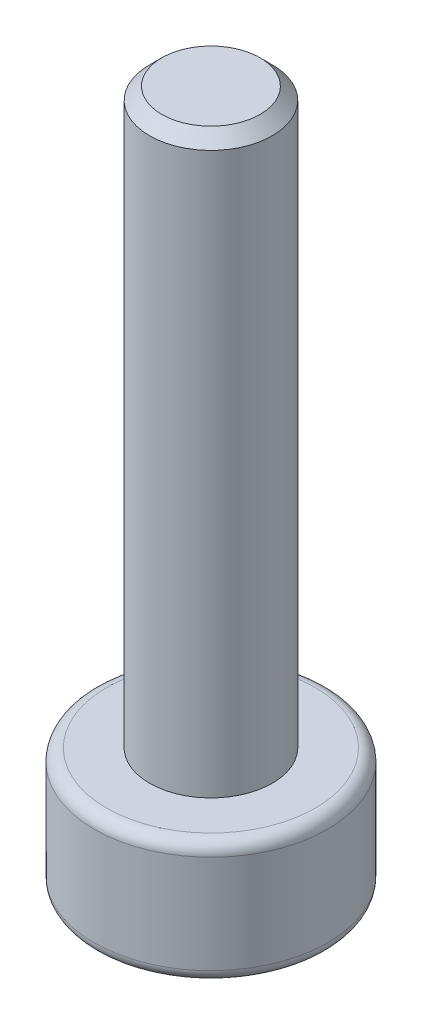
ISO-10303-21;
HEADER;
FILE_DESCRIPTION(('STEP AP214'),'2;1');
FILE_NAME('part.step','',(''),(''),'','','');
FILE_SCHEMA(('AUTOMOTIVE_DESIGN { 1 0 10303 214 1 1 1 1 }'));
ENDSEC;
DATA;
#1=APPLICATION_CONTEXT('core data for automotive mechanical design processes');
#2=APPLICATION_PROTOCOL_DEFINITION('international standard','automotive_design',2000,#1);
#3=PRODUCT_CONTEXT('',#1,'mechanical');
#4=PRODUCT('Part','Part','',(#3));
#5=PRODUCT_RELATED_PRODUCT_CATEGORY('part','',(#4));
#6=PRODUCT_DEFINITION_FORMATION('','',#4);
#7=PRODUCT_DEFINITION_CONTEXT('part definition',#1,'design');
#8=PRODUCT_DEFINITION('design','',#6,#7);
#9=PRODUCT_DEFINITION_SHAPE('','',#8);
#10=(LENGTH_UNIT() NAMED_UNIT(*) SI_UNIT(.MILLI.,.METRE.));
#11=(NAMED_UNIT(*) PLANE_ANGLE_UNIT() SI_UNIT($,.RADIAN.));
#12=(NAMED_UNIT(*) SI_UNIT($,.STERADIAN.) SOLID_ANGLE_UNIT());
#13=UNCERTAINTY_MEASURE_WITH_UNIT(LENGTH_MEASURE(1.E-05),#10,'distance_accuracy_value','');
#14=(GEOMETRIC_REPRESENTATION_CONTEXT(3) GLOBAL_UNCERTAINTY_ASSIGNED_CONTEXT((#13)) GLOBAL_UNIT_ASSIGNED_CONTEXT((#10,
#11,#12)) REPRESENTATION_CONTEXT('',''));
#15=CARTESIAN_POINT('',(0.,0.,0.));
#16=DIRECTION('',(0.,0.,1.));
#17=DIRECTION('',(1.,0.,0.));
#18=AXIS2_PLACEMENT_3D('',#15,#16,#17);
#19=CARTESIAN_POINT('',(0.,3.,0.));
#20=DIRECTION('',(0.,-1.,0.));
#21=DIRECTION('',(0.,0.,-1.));
#22=AXIS2_PLACEMENT_3D('',#19,#20,#21);
#23=CYLINDRICAL_SURFACE('',#22,2.85);
#24=CARTESIAN_POINT('',(0.,2.7,0.));
#25=DIRECTION('',(0.,1.,0.));
#26=DIRECTION('',(0.,0.,1.));
#27=AXIS2_PLACEMENT_3D('',#24,#25,#26);
#28=CIRCLE('',#27,2.85);
#29=CARTESIAN_POINT('',(0.,2.7,2.85));
#30=VERTEX_POINT('',#29);
#31=EDGE_CURVE('E68',#30,#30,#28,.F.);
#32=ORIENTED_EDGE('',*,*,#31,.T.);
#33=EDGE_LOOP('',(#32));
#34=FACE_BOUND('',#33,.T.);
#35=CARTESIAN_POINT('',(0.,0.3,0.));
#36=DIRECTION('',(0.,1.,0.));
#37=DIRECTION('',(0.,0.,1.));
#38=AXIS2_PLACEMENT_3D('',#35,#36,#37);
#39=CIRCLE('',#38,2.85);
#40=CARTESIAN_POINT('',(0.,0.3,2.85));
#41=VERTEX_POINT('',#40);
#42=EDGE_CURVE('E72',#41,#41,#39,.T.);
#43=ORIENTED_EDGE('',*,*,#42,.T.);
#44=EDGE_LOOP('',(#43));
#45=FACE_BOUND('',#44,.T.);
#46=ADVANCED_FACE('F39',(#34,#45),#23,.T.);
#47=CARTESIAN_POINT('',(0.,3.,0.));
#48=DIRECTION('',(0.,1.,0.));
#49=DIRECTION('',(0.,0.,1.));
#50=AXIS2_PLACEMENT_3D('',#47,#48,#49);
#51=PLANE('',#50);
#52=CARTESIAN_POINT('',(0.,3.,0.));
#53=DIRECTION('',(0.,1.,0.));
#54=DIRECTION('',(0.,0.,1.));
#55=AXIS2_PLACEMENT_3D('',#52,#53,#54);
#56=CIRCLE('',#55,2.55);
#57=CARTESIAN_POINT('',(0.,3.,2.55));
#58=VERTEX_POINT('',#57);
#59=EDGE_CURVE('E76',#58,#58,#56,.T.);
#60=ORIENTED_EDGE('',*,*,#59,.T.);
#61=EDGE_LOOP('',(#60));
#62=FACE_BOUND('',#61,.T.);
#63=CARTESIAN_POINT('',(0.,3.,0.));
#64=DIRECTION('',(0.,1.,0.));
#65=DIRECTION('',(0.,0.,1.));
#66=AXIS2_PLACEMENT_3D('',#63,#64,#65);
#67=CIRCLE('',#66,1.5);
#68=CARTESIAN_POINT('',(0.,3.,1.5));
#69=VERTEX_POINT('',#68);
#70=EDGE_CURVE('E80',#69,#69,#67,.T.);
#71=ORIENTED_EDGE('',*,*,#70,.F.);
#72=EDGE_LOOP('',(#71));
#73=FACE_BOUND('',#72,.T.);
#74=ADVANCED_FACE('F105',(#62,#73),#51,.T.);
#75=CARTESIAN_POINT('',(0.,0.,0.));
#76=DIRECTION('',(0.,1.,0.));
#77=DIRECTION('',(0.,0.,1.));
#78=AXIS2_PLACEMENT_3D('',#75,#76,#77);
#79=PLANE('',#78);
#80=CARTESIAN_POINT('',(0.,0.,0.));
#81=DIRECTION('',(0.,1.,0.));
#82=DIRECTION('',(0.,0.,1.));
#83=AXIS2_PLACEMENT_3D('',#80,#81,#82);
#84=CIRCLE('',#83,1.44);
#85=CARTESIAN_POINT('',(0.,0.,1.44));
#86=VERTEX_POINT('',#85);
#87=EDGE_CURVE('E10',#86,#86,#84,.T.);
#88=ORIENTED_EDGE('',*,*,#87,.T.);
#89=EDGE_LOOP('',(#88));
#90=FACE_BOUND('',#89,.T.);
#91=CARTESIAN_POINT('',(0.,0.,0.));
#92=DIRECTION('',(0.,1.,0.));
#93=DIRECTION('',(0.,0.,1.));
#94=AXIS2_PLACEMENT_3D('',#91,#92,#93);
#95=CIRCLE('',#94,2.55);
#96=CARTESIAN_POINT('',(0.,0.,2.55));
#97=VERTEX_POINT('',#96);
#98=EDGE_CURVE('E64',#97,#97,#95,.F.);
#99=ORIENTED_EDGE('',*,*,#98,.T.);
#100=EDGE_LOOP('',(#99));
#101=FACE_BOUND('',#100,.T.);
#102=ADVANCED_FACE('F111',(#90,#101),#79,.F.);
#103=CARTESIAN_POINT('',(0.,17.,0.));
#104=DIRECTION('',(0.,-1.,0.));
#105=DIRECTION('',(0.,0.,-1.));
#106=AXIS2_PLACEMENT_3D('',#103,#104,#105);
#107=CYLINDRICAL_SURFACE('',#106,1.5);
#108=CARTESIAN_POINT('',(0.,16.7,0.));
#109=DIRECTION('',(0.,1.,0.));
#110=DIRECTION('',(0.,0.,1.));
#111=AXIS2_PLACEMENT_3D('',#108,#109,#110);
#112=CIRCLE('',#111,1.5);
#113=CARTESIAN_POINT('',(0.,16.7,1.5));
#114=VERTEX_POINT('',#113);
#115=EDGE_CURVE('E53',#114,#114,#112,.F.);
#116=ORIENTED_EDGE('',*,*,#115,.T.);
#117=EDGE_LOOP('',(#116));
#118=FACE_BOUND('',#117,.T.);
#119=ORIENTED_EDGE('',*,*,#70,.T.);
#120=EDGE_LOOP('',(#119));
#121=FACE_BOUND('',#120,.T.);
#122=ADVANCED_FACE('F101',(#118,#121),#107,.T.);
#123=CARTESIAN_POINT('',(0.,17.,0.));
#124=DIRECTION('',(0.,1.,0.));
#125=DIRECTION('',(0.,0.,1.));
#126=AXIS2_PLACEMENT_3D('',#123,#124,#125);
#127=PLANE('',#126);
#128=CARTESIAN_POINT('',(0.,17.,0.));
#129=DIRECTION('',(0.,1.,0.));
#130=DIRECTION('',(0.,0.,1.));
#131=AXIS2_PLACEMENT_3D('',#128,#129,#130);
#132=CIRCLE('',#131,1.2);
#133=CARTESIAN_POINT('',(0.,17.,1.2));
#134=VERTEX_POINT('',#133);
#135=EDGE_CURVE('E58',#134,#134,#132,.T.);
#136=ORIENTED_EDGE('',*,*,#135,.T.);
#137=EDGE_LOOP('',(#136));
#138=FACE_BOUND('',#137,.T.);
#139=ADVANCED_FACE('F93',(#138),#127,.T.);
#140=CARTESIAN_POINT('',(0.,1.3,0.));
#141=DIRECTION('',(0.,-1.,0.));
#142=DIRECTION('',(0.,0.,-1.));
#143=AXIS2_PLACEMENT_3D('',#140,#141,#142);
#144=CYLINDRICAL_SURFACE('',#143,1.29);
#145=CARTESIAN_POINT('',(0.,0.149999999999998,0.));
#146=DIRECTION('',(0.,1.,0.));
#147=DIRECTION('',(0.,0.,1.));
#148=AXIS2_PLACEMENT_3D('',#145,#146,#147);
#149=CIRCLE('',#148,1.29);
#150=CARTESIAN_POINT('',(0.,0.149999999999998,1.29));
#151=VERTEX_POINT('',#150);
#152=EDGE_CURVE('E48',#151,#151,#149,.F.);
#153=ORIENTED_EDGE('',*,*,#152,.T.);
#154=EDGE_LOOP('',(#153));
#155=FACE_BOUND('',#154,.T.);
#156=CARTESIAN_POINT('',(0.,1.3,0.));
#157=DIRECTION('',(0.,-1.,0.));
#158=DIRECTION('',(0.,0.,-1.));
#159=AXIS2_PLACEMENT_3D('',#156,#157,#158);
#160=CIRCLE('',#159,1.29);
#161=CARTESIAN_POINT('',(0.,1.3,-1.29));
#162=VERTEX_POINT('',#161);
#163=EDGE_CURVE('E84',#162,#162,#160,.T.);
#164=ORIENTED_EDGE('',*,*,#163,.F.);
#165=EDGE_LOOP('',(#164));
#166=FACE_BOUND('',#165,.T.);
#167=ADVANCED_FACE('F91',(#155,#166),#144,.F.);
#168=CARTESIAN_POINT('',(0.,1.3,0.));
#169=DIRECTION('',(0.,-1.,0.));
#170=DIRECTION('',(0.,0.,-1.));
#171=AXIS2_PLACEMENT_3D('',#168,#169,#170);
#172=PLANE('',#171);
#173=ORIENTED_EDGE('',*,*,#163,.T.);
#174=EDGE_LOOP('',(#173));
#175=FACE_BOUND('',#174,.T.);
#176=ADVANCED_FACE('F89',(#175),#172,.T.);
#177=CARTESIAN_POINT('',(0.,2.7,0.));
#178=DIRECTION('',(0.,1.,0.));
#179=DIRECTION('',(0.,0.,1.));
#180=AXIS2_PLACEMENT_3D('',#177,#178,#179);
#181=TOROIDAL_SURFACE('',#180,2.55,0.3);
#182=ORIENTED_EDGE('',*,*,#31,.F.);
#183=EDGE_LOOP('',(#182));
#184=FACE_BOUND('',#183,.T.);
#185=ORIENTED_EDGE('',*,*,#59,.F.);
#186=EDGE_LOOP('',(#185));
#187=FACE_BOUND('',#186,.T.);
#188=ADVANCED_FACE('F99',(#184,#187),#181,.T.);
#189=CARTESIAN_POINT('',(0.,0.3,0.));
#190=DIRECTION('',(0.,1.,0.));
#191=DIRECTION('',(0.,0.,1.));
#192=AXIS2_PLACEMENT_3D('',#189,#190,#191);
#193=TOROIDAL_SURFACE('',#192,2.55,0.3);
#194=ORIENTED_EDGE('',*,*,#98,.F.);
#195=EDGE_LOOP('',(#194));
#196=FACE_BOUND('',#195,.T.);
#197=ORIENTED_EDGE('',*,*,#42,.F.);
#198=EDGE_LOOP('',(#197));
#199=FACE_BOUND('',#198,.T.);
#200=ADVANCED_FACE('F119',(#196,#199),#193,.T.);
#201=CARTESIAN_POINT('',(0.,17.,0.));
#202=DIRECTION('',(0.,-1.,0.));
#203=DIRECTION('',(0.,0.,-1.));
#204=AXIS2_PLACEMENT_3D('',#201,#202,#203);
#205=CONICAL_SURFACE('',#204,1.2,0.785398163397447);
#206=ORIENTED_EDGE('',*,*,#115,.F.);
#207=EDGE_LOOP('',(#206));
#208=FACE_BOUND('',#207,.T.);
#209=ORIENTED_EDGE('',*,*,#135,.F.);
#210=EDGE_LOOP('',(#209));
#211=FACE_BOUND('',#210,.T.);
#212=ADVANCED_FACE('F122',(#208,#211),#205,.T.);
#213=CARTESIAN_POINT('',(0.,0.149999999999998,0.));
#214=DIRECTION('',(0.,-1.,0.));
#215=DIRECTION('',(0.,0.,-1.));
#216=AXIS2_PLACEMENT_3D('',#213,#214,#215);
#217=CONICAL_SURFACE('',#216,1.29,0.785398163397456);
#218=ORIENTED_EDGE('',*,*,#87,.F.);
#219=EDGE_LOOP('',(#218));
#220=FACE_BOUND('',#219,.T.);
#221=ORIENTED_EDGE('',*,*,#152,.F.);
#222=EDGE_LOOP('',(#221));
#223=FACE_BOUND('',#222,.T.);
#224=ADVANCED_FACE('F42',(#220,#223),#217,.F.);
#225=CLOSED_SHELL('',(#46,#74,#102,#122,#139,#167,#176,#188,#200,#212,#224));
#226=MANIFOLD_SOLID_BREP('B2',#225);
#227=ADVANCED_BREP_SHAPE_REPRESENTATION('',(#18,#226),#14);
#228=SHAPE_DEFINITION_REPRESENTATION(#9,#227);
ENDSEC;
END-ISO-10303-21;
